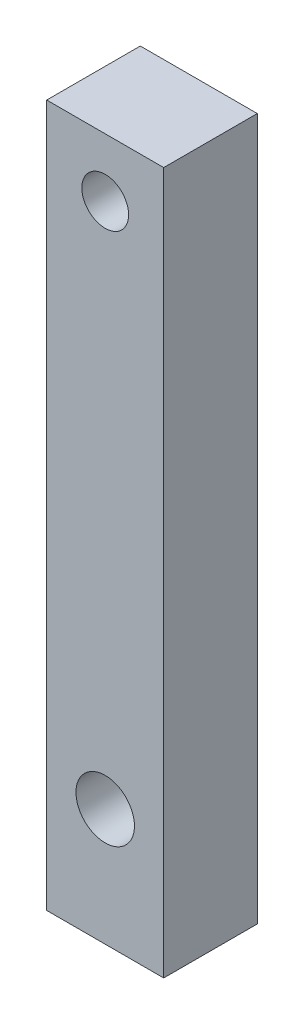
ISO-10303-21;
HEADER;
FILE_DESCRIPTION(('STEP AP214'),'2;1');
FILE_NAME('part.step','',(''),(''),'','','');
FILE_SCHEMA(('AUTOMOTIVE_DESIGN { 1 0 10303 214 1 1 1 1 }'));
ENDSEC;
DATA;
#1=APPLICATION_CONTEXT('core data for automotive mechanical design processes');
#2=APPLICATION_PROTOCOL_DEFINITION('international standard','automotive_design',2000,#1);
#3=PRODUCT_CONTEXT('',#1,'mechanical');
#4=PRODUCT('Part','Part','',(#3));
#5=PRODUCT_RELATED_PRODUCT_CATEGORY('part','',(#4));
#6=PRODUCT_DEFINITION_FORMATION('','',#4);
#7=PRODUCT_DEFINITION_CONTEXT('part definition',#1,'design');
#8=PRODUCT_DEFINITION('design','',#6,#7);
#9=PRODUCT_DEFINITION_SHAPE('','',#8);
#10=(LENGTH_UNIT() NAMED_UNIT(*) SI_UNIT(.MILLI.,.METRE.));
#11=(NAMED_UNIT(*) PLANE_ANGLE_UNIT() SI_UNIT($,.RADIAN.));
#12=(NAMED_UNIT(*) SI_UNIT($,.STERADIAN.) SOLID_ANGLE_UNIT());
#13=UNCERTAINTY_MEASURE_WITH_UNIT(LENGTH_MEASURE(1.E-05),#10,'distance_accuracy_value','');
#14=(GEOMETRIC_REPRESENTATION_CONTEXT(3) GLOBAL_UNCERTAINTY_ASSIGNED_CONTEXT((#13)) GLOBAL_UNIT_ASSIGNED_CONTEXT((#10,
#11,#12)) REPRESENTATION_CONTEXT('',''));
#15=CARTESIAN_POINT('',(0.,0.,0.));
#16=DIRECTION('',(0.,0.,1.));
#17=DIRECTION('',(1.,0.,0.));
#18=AXIS2_PLACEMENT_3D('',#15,#16,#17);
#19=CARTESIAN_POINT('',(0.,-51.1948529411765,8.));
#20=DIRECTION('',(0.,1.,0.));
#21=DIRECTION('',(0.,0.,1.));
#22=AXIS2_PLACEMENT_3D('',#19,#20,#21);
#23=PLANE('',#22);
#24=DIRECTION('',(1.,0.,0.));
#25=VECTOR('',#24,1.);
#26=CARTESIAN_POINT('',(0.,-51.1948529411765,0.));
#27=LINE('',#26,#25);
#28=CARTESIAN_POINT('',(-3.97058823529411,-51.1948529411765,0.));
#29=VERTEX_POINT('',#28);
#30=CARTESIAN_POINT('',(6.02941176470589,-51.1948529411765,0.));
#31=VERTEX_POINT('',#30);
#32=EDGE_CURVE('E105',#29,#31,#27,.T.);
#33=ORIENTED_EDGE('',*,*,#32,.T.);
#34=DIRECTION('',(0.,0.,-1.));
#35=VECTOR('',#34,1.);
#36=CARTESIAN_POINT('',(6.02941176470589,-51.1948529411765,8.));
#37=LINE('',#36,#35);
#38=CARTESIAN_POINT('',(6.02941176470589,-51.1948529411765,8.));
#39=VERTEX_POINT('',#38);
#40=EDGE_CURVE('E11',#39,#31,#37,.T.);
#41=ORIENTED_EDGE('',*,*,#40,.F.);
#42=DIRECTION('',(1.,0.,0.));
#43=VECTOR('',#42,1.);
#44=CARTESIAN_POINT('',(0.,-51.1948529411765,8.));
#45=LINE('',#44,#43);
#46=CARTESIAN_POINT('',(-3.97058823529411,-51.1948529411765,8.));
#47=VERTEX_POINT('',#46);
#48=EDGE_CURVE('E85',#47,#39,#45,.T.);
#49=ORIENTED_EDGE('',*,*,#48,.F.);
#50=DIRECTION('',(0.,0.,-1.));
#51=VECTOR('',#50,1.);
#52=CARTESIAN_POINT('',(-3.97058823529411,-51.1948529411765,8.));
#53=LINE('',#52,#51);
#54=EDGE_CURVE('E51',#47,#29,#53,.T.);
#55=ORIENTED_EDGE('',*,*,#54,.T.);
#56=EDGE_LOOP('',(#33,#41,#49,#55));
#57=FACE_BOUND('',#56,.T.);
#58=ADVANCED_FACE('F35',(#57),#23,.F.);
#59=CARTESIAN_POINT('',(6.02941176470588,0.,8.));
#60=DIRECTION('',(-1.,0.,0.));
#61=DIRECTION('',(0.,-1.,0.));
#62=AXIS2_PLACEMENT_3D('',#59,#60,#61);
#63=PLANE('',#62);
#64=DIRECTION('',(0.,1.,0.));
#65=VECTOR('',#64,1.);
#66=CARTESIAN_POINT('',(6.02941176470588,0.,0.));
#67=LINE('',#66,#65);
#68=CARTESIAN_POINT('',(6.02941176470588,8.80514705882353,0.));
#69=VERTEX_POINT('',#68);
#70=EDGE_CURVE('E90',#31,#69,#67,.T.);
#71=ORIENTED_EDGE('',*,*,#70,.T.);
#72=DIRECTION('',(0.,0.,-1.));
#73=VECTOR('',#72,1.);
#74=CARTESIAN_POINT('',(6.02941176470588,8.80514705882353,8.));
#75=LINE('',#74,#73);
#76=CARTESIAN_POINT('',(6.02941176470588,8.80514705882353,8.));
#77=VERTEX_POINT('',#76);
#78=EDGE_CURVE('E43',#77,#69,#75,.T.);
#79=ORIENTED_EDGE('',*,*,#78,.F.);
#80=DIRECTION('',(0.,1.,0.));
#81=VECTOR('',#80,1.);
#82=CARTESIAN_POINT('',(6.02941176470588,0.,8.));
#83=LINE('',#82,#81);
#84=EDGE_CURVE('E76',#39,#77,#83,.T.);
#85=ORIENTED_EDGE('',*,*,#84,.F.);
#86=ORIENTED_EDGE('',*,*,#40,.T.);
#87=EDGE_LOOP('',(#71,#79,#85,#86));
#88=FACE_BOUND('',#87,.T.);
#89=ADVANCED_FACE('F89',(#88),#63,.F.);
#90=CARTESIAN_POINT('',(0.,8.80514705882353,8.));
#91=DIRECTION('',(0.,1.,0.));
#92=DIRECTION('',(0.,0.,1.));
#93=AXIS2_PLACEMENT_3D('',#90,#91,#92);
#94=PLANE('',#93);
#95=DIRECTION('',(1.,0.,0.));
#96=VECTOR('',#95,1.);
#97=CARTESIAN_POINT('',(0.,8.80514705882353,0.));
#98=LINE('',#97,#96);
#99=CARTESIAN_POINT('',(-3.97058823529412,8.80514705882353,0.));
#100=VERTEX_POINT('',#99);
#101=EDGE_CURVE('E108',#100,#69,#98,.T.);
#102=ORIENTED_EDGE('',*,*,#101,.F.);
#103=DIRECTION('',(0.,0.,-1.));
#104=VECTOR('',#103,1.);
#105=CARTESIAN_POINT('',(-3.97058823529412,8.80514705882353,8.));
#106=LINE('',#105,#104);
#107=CARTESIAN_POINT('',(-3.97058823529412,8.80514705882353,8.));
#108=VERTEX_POINT('',#107);
#109=EDGE_CURVE('E65',#108,#100,#106,.T.);
#110=ORIENTED_EDGE('',*,*,#109,.F.);
#111=DIRECTION('',(1.,0.,0.));
#112=VECTOR('',#111,1.);
#113=CARTESIAN_POINT('',(0.,8.80514705882353,8.));
#114=LINE('',#113,#112);
#115=EDGE_CURVE('E84',#108,#77,#114,.T.);
#116=ORIENTED_EDGE('',*,*,#115,.T.);
#117=ORIENTED_EDGE('',*,*,#78,.T.);
#118=EDGE_LOOP('',(#102,#110,#116,#117));
#119=FACE_BOUND('',#118,.T.);
#120=ADVANCED_FACE('F93',(#119),#94,.T.);
#121=CARTESIAN_POINT('',(1.02941176470588,3.80514705882353,8.));
#122=DIRECTION('',(0.,0.,-1.));
#123=DIRECTION('',(-1.,0.,0.));
#124=AXIS2_PLACEMENT_3D('',#121,#122,#123);
#125=CYLINDRICAL_SURFACE('',#124,2.);
#126=CARTESIAN_POINT('',(1.02941176470588,3.80514705882353,8.));
#127=DIRECTION('',(0.,0.,1.));
#128=DIRECTION('',(1.,0.,0.));
#129=AXIS2_PLACEMENT_3D('',#126,#127,#128);
#130=CIRCLE('',#129,2.);
#131=CARTESIAN_POINT('',(3.02941176470588,3.80514705882353,8.));
#132=VERTEX_POINT('',#131);
#133=EDGE_CURVE('E96',#132,#132,#130,.T.);
#134=ORIENTED_EDGE('',*,*,#133,.T.);
#135=EDGE_LOOP('',(#134));
#136=FACE_BOUND('',#135,.T.);
#137=CARTESIAN_POINT('',(1.02941176470588,3.80514705882353,0.));
#138=DIRECTION('',(0.,0.,1.));
#139=DIRECTION('',(1.,0.,0.));
#140=AXIS2_PLACEMENT_3D('',#137,#138,#139);
#141=CIRCLE('',#140,2.);
#142=CARTESIAN_POINT('',(3.02941176470588,3.80514705882353,0.));
#143=VERTEX_POINT('',#142);
#144=EDGE_CURVE('E113',#143,#143,#141,.T.);
#145=ORIENTED_EDGE('',*,*,#144,.F.);
#146=EDGE_LOOP('',(#145));
#147=FACE_BOUND('',#146,.T.);
#148=ADVANCED_FACE('F134',(#136,#147),#125,.F.);
#149=CARTESIAN_POINT('',(-3.97058823529412,0.,8.));
#150=DIRECTION('',(-1.,0.,0.));
#151=DIRECTION('',(0.,0.,1.));
#152=AXIS2_PLACEMENT_3D('',#149,#150,#151);
#153=PLANE('',#152);
#154=DIRECTION('',(0.,1.,0.));
#155=VECTOR('',#154,1.);
#156=CARTESIAN_POINT('',(-3.97058823529412,0.,0.));
#157=LINE('',#156,#155);
#158=EDGE_CURVE('E110',#29,#100,#157,.T.);
#159=ORIENTED_EDGE('',*,*,#158,.F.);
#160=ORIENTED_EDGE('',*,*,#54,.F.);
#161=DIRECTION('',(0.,1.,0.));
#162=VECTOR('',#161,1.);
#163=CARTESIAN_POINT('',(-3.97058823529412,0.,8.));
#164=LINE('',#163,#162);
#165=EDGE_CURVE('E94',#47,#108,#164,.T.);
#166=ORIENTED_EDGE('',*,*,#165,.T.);
#167=ORIENTED_EDGE('',*,*,#109,.T.);
#168=EDGE_LOOP('',(#159,#160,#166,#167));
#169=FACE_BOUND('',#168,.T.);
#170=ADVANCED_FACE('F126',(#169),#153,.T.);
#171=CARTESIAN_POINT('',(1.02941176470589,-41.1948529411765,8.));
#172=DIRECTION('',(0.,0.,-1.));
#173=DIRECTION('',(-1.,0.,0.));
#174=AXIS2_PLACEMENT_3D('',#171,#172,#173);
#175=CYLINDRICAL_SURFACE('',#174,2.5);
#176=CARTESIAN_POINT('',(1.02941176470589,-41.1948529411765,8.));
#177=DIRECTION('',(0.,0.,1.));
#178=DIRECTION('',(1.,0.,0.));
#179=AXIS2_PLACEMENT_3D('',#176,#177,#178);
#180=CIRCLE('',#179,2.5);
#181=CARTESIAN_POINT('',(3.52941176470589,-41.1948529411765,8.));
#182=VERTEX_POINT('',#181);
#183=EDGE_CURVE('E102',#182,#182,#180,.T.);
#184=ORIENTED_EDGE('',*,*,#183,.T.);
#185=EDGE_LOOP('',(#184));
#186=FACE_BOUND('',#185,.T.);
#187=CARTESIAN_POINT('',(1.02941176470589,-41.1948529411765,0.));
#188=DIRECTION('',(0.,0.,1.));
#189=DIRECTION('',(1.,0.,0.));
#190=AXIS2_PLACEMENT_3D('',#187,#188,#189);
#191=CIRCLE('',#190,2.5);
#192=CARTESIAN_POINT('',(3.52941176470589,-41.1948529411765,0.));
#193=VERTEX_POINT('',#192);
#194=EDGE_CURVE('E116',#193,#193,#191,.T.);
#195=ORIENTED_EDGE('',*,*,#194,.F.);
#196=EDGE_LOOP('',(#195));
#197=FACE_BOUND('',#196,.T.);
#198=ADVANCED_FACE('F124',(#186,#197),#175,.F.);
#199=CARTESIAN_POINT('',(0.,0.,8.));
#200=DIRECTION('',(0.,0.,1.));
#201=DIRECTION('',(1.,0.,0.));
#202=AXIS2_PLACEMENT_3D('',#199,#200,#201);
#203=PLANE('',#202);
#204=ORIENTED_EDGE('',*,*,#48,.T.);
#205=ORIENTED_EDGE('',*,*,#84,.T.);
#206=ORIENTED_EDGE('',*,*,#115,.F.);
#207=ORIENTED_EDGE('',*,*,#165,.F.);
#208=EDGE_LOOP('',(#204,#205,#206,#207));
#209=FACE_BOUND('',#208,.T.);
#210=ORIENTED_EDGE('',*,*,#133,.F.);
#211=EDGE_LOOP('',(#210));
#212=FACE_BOUND('',#211,.T.);
#213=ORIENTED_EDGE('',*,*,#183,.F.);
#214=EDGE_LOOP('',(#213));
#215=FACE_BOUND('',#214,.T.);
#216=ADVANCED_FACE('F80',(#209,#212,#215),#203,.T.);
#217=CARTESIAN_POINT('',(0.,0.,0.));
#218=DIRECTION('',(0.,0.,1.));
#219=DIRECTION('',(1.,0.,0.));
#220=AXIS2_PLACEMENT_3D('',#217,#218,#219);
#221=PLANE('',#220);
#222=ORIENTED_EDGE('',*,*,#32,.F.);
#223=ORIENTED_EDGE('',*,*,#158,.T.);
#224=ORIENTED_EDGE('',*,*,#101,.T.);
#225=ORIENTED_EDGE('',*,*,#70,.F.);
#226=EDGE_LOOP('',(#222,#223,#224,#225));
#227=FACE_BOUND('',#226,.T.);
#228=ORIENTED_EDGE('',*,*,#144,.T.);
#229=EDGE_LOOP('',(#228));
#230=FACE_BOUND('',#229,.T.);
#231=ORIENTED_EDGE('',*,*,#194,.T.);
#232=EDGE_LOOP('',(#231));
#233=FACE_BOUND('',#232,.T.);
#234=ADVANCED_FACE('F122',(#227,#230,#233),#221,.F.);
#235=CLOSED_SHELL('',(#58,#89,#120,#148,#170,#198,#216,#234));
#236=MANIFOLD_SOLID_BREP('B2',#235);
#237=ADVANCED_BREP_SHAPE_REPRESENTATION('',(#18,#236),#14);
#238=SHAPE_DEFINITION_REPRESENTATION(#9,#237);
ENDSEC;
END-ISO-10303-21;
